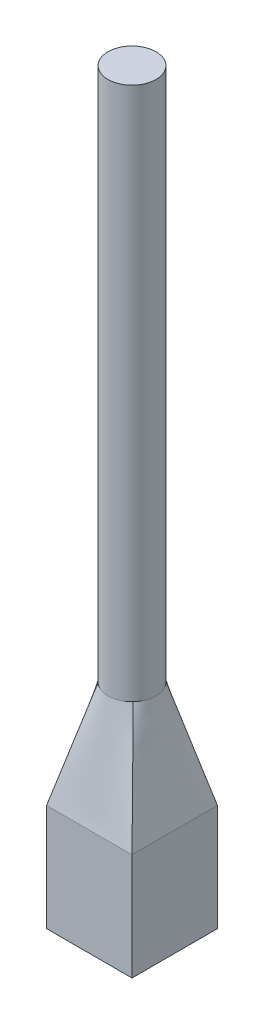
ISO-10303-21;
HEADER;
FILE_DESCRIPTION(('STEP AP214'),'2;1');
FILE_NAME('part.step','',(''),(''),'','','');
FILE_SCHEMA(('AUTOMOTIVE_DESIGN { 1 0 10303 214 1 1 1 1 }'));
ENDSEC;
DATA;
#1=APPLICATION_CONTEXT('core data for automotive mechanical design processes');
#2=APPLICATION_PROTOCOL_DEFINITION('international standard','automotive_design',2000,#1);
#3=PRODUCT_CONTEXT('',#1,'mechanical');
#4=PRODUCT('Part','Part','',(#3));
#5=PRODUCT_RELATED_PRODUCT_CATEGORY('part','',(#4));
#6=PRODUCT_DEFINITION_FORMATION('','',#4);
#7=PRODUCT_DEFINITION_CONTEXT('part definition',#1,'design');
#8=PRODUCT_DEFINITION('design','',#6,#7);
#9=PRODUCT_DEFINITION_SHAPE('','',#8);
#10=(LENGTH_UNIT() NAMED_UNIT(*) SI_UNIT(.MILLI.,.METRE.));
#11=(NAMED_UNIT(*) PLANE_ANGLE_UNIT() SI_UNIT($,.RADIAN.));
#12=(NAMED_UNIT(*) SI_UNIT($,.STERADIAN.) SOLID_ANGLE_UNIT());
#13=UNCERTAINTY_MEASURE_WITH_UNIT(LENGTH_MEASURE(1.E-05),#10,'distance_accuracy_value','');
#14=(GEOMETRIC_REPRESENTATION_CONTEXT(3) GLOBAL_UNCERTAINTY_ASSIGNED_CONTEXT((#13)) GLOBAL_UNIT_ASSIGNED_CONTEXT((#10,
#11,#12)) REPRESENTATION_CONTEXT('',''));
#15=CARTESIAN_POINT('',(0.,0.,0.));
#16=DIRECTION('',(0.,0.,1.));
#17=DIRECTION('',(1.,0.,0.));
#18=AXIS2_PLACEMENT_3D('',#15,#16,#17);
#19=CARTESIAN_POINT('',(-0.4,1.,0.4));
#20=DIRECTION('',(1.,0.,0.));
#21=DIRECTION('',(0.,0.,-1.));
#22=AXIS2_PLACEMENT_3D('',#19,#20,#21);
#23=PLANE('',#22);
#24=DIRECTION('',(0.,0.,1.));
#25=VECTOR('',#24,1.);
#26=CARTESIAN_POINT('',(-0.4,0.,0.4));
#27=LINE('',#26,#25);
#28=CARTESIAN_POINT('',(-0.4,0.,-0.4));
#29=VERTEX_POINT('',#28);
#30=CARTESIAN_POINT('',(-0.4,0.,0.4));
#31=VERTEX_POINT('',#30);
#32=EDGE_CURVE('E181',#29,#31,#27,.T.);
#33=ORIENTED_EDGE('',*,*,#32,.T.);
#34=DIRECTION('',(0.,-1.,0.));
#35=VECTOR('',#34,1.);
#36=CARTESIAN_POINT('',(-0.4,1.,0.4));
#37=LINE('',#36,#35);
#38=CARTESIAN_POINT('',(-0.4,1.,0.4));
#39=VERTEX_POINT('',#38);
#40=EDGE_CURVE('E14',#39,#31,#37,.T.);
#41=ORIENTED_EDGE('',*,*,#40,.F.);
#42=DIRECTION('',(0.,0.,-1.));
#43=VECTOR('',#42,1.);
#44=CARTESIAN_POINT('',(-0.4,1.,0.4));
#45=LINE('',#44,#43);
#46=CARTESIAN_POINT('',(-0.4,1.,-0.4));
#47=VERTEX_POINT('',#46);
#48=EDGE_CURVE('E312',#47,#39,#45,.F.);
#49=ORIENTED_EDGE('',*,*,#48,.F.);
#50=DIRECTION('',(0.,-1.,0.));
#51=VECTOR('',#50,1.);
#52=CARTESIAN_POINT('',(-0.4,1.,-0.4));
#53=LINE('',#52,#51);
#54=EDGE_CURVE('E316',#47,#29,#53,.T.);
#55=ORIENTED_EDGE('',*,*,#54,.T.);
#56=EDGE_LOOP('',(#33,#41,#49,#55));
#57=FACE_BOUND('',#56,.T.);
#58=ADVANCED_FACE('F80',(#57),#23,.F.);
#59=CARTESIAN_POINT('',(0.4,1.,0.4));
#60=DIRECTION('',(0.,0.,-1.));
#61=DIRECTION('',(-1.,0.,0.));
#62=AXIS2_PLACEMENT_3D('',#59,#60,#61);
#63=PLANE('',#62);
#64=DIRECTION('',(1.,0.,0.));
#65=VECTOR('',#64,1.);
#66=CARTESIAN_POINT('',(0.4,0.,0.4));
#67=LINE('',#66,#65);
#68=CARTESIAN_POINT('',(0.4,0.,0.4));
#69=VERTEX_POINT('',#68);
#70=EDGE_CURVE('E302',#31,#69,#67,.T.);
#71=ORIENTED_EDGE('',*,*,#70,.T.);
#72=DIRECTION('',(0.,-1.,0.));
#73=VECTOR('',#72,1.);
#74=CARTESIAN_POINT('',(0.4,1.,0.4));
#75=LINE('',#74,#73);
#76=CARTESIAN_POINT('',(0.4,1.,0.4));
#77=VERTEX_POINT('',#76);
#78=EDGE_CURVE('E88',#77,#69,#75,.T.);
#79=ORIENTED_EDGE('',*,*,#78,.F.);
#80=DIRECTION('',(-1.,0.,0.));
#81=VECTOR('',#80,1.);
#82=CARTESIAN_POINT('',(0.4,1.,0.4));
#83=LINE('',#82,#81);
#84=EDGE_CURVE('E117',#39,#77,#83,.F.);
#85=ORIENTED_EDGE('',*,*,#84,.F.);
#86=ORIENTED_EDGE('',*,*,#40,.T.);
#87=EDGE_LOOP('',(#71,#79,#85,#86));
#88=FACE_BOUND('',#87,.T.);
#89=ADVANCED_FACE('F296',(#88),#63,.F.);
#90=CARTESIAN_POINT('',(0.4,1.,0.4));
#91=DIRECTION('',(-1.,0.,0.));
#92=DIRECTION('',(0.,0.,1.));
#93=AXIS2_PLACEMENT_3D('',#90,#91,#92);
#94=PLANE('',#93);
#95=DIRECTION('',(0.,0.,-1.));
#96=VECTOR('',#95,1.);
#97=CARTESIAN_POINT('',(0.4,0.,0.4));
#98=LINE('',#97,#96);
#99=CARTESIAN_POINT('',(0.4,0.,-0.4));
#100=VERTEX_POINT('',#99);
#101=EDGE_CURVE('E308',#69,#100,#98,.T.);
#102=ORIENTED_EDGE('',*,*,#101,.T.);
#103=DIRECTION('',(0.,-1.,0.));
#104=VECTOR('',#103,1.);
#105=CARTESIAN_POINT('',(0.4,1.,-0.4));
#106=LINE('',#105,#104);
#107=CARTESIAN_POINT('',(0.4,1.,-0.4));
#108=VERTEX_POINT('',#107);
#109=EDGE_CURVE('E105',#108,#100,#106,.T.);
#110=ORIENTED_EDGE('',*,*,#109,.F.);
#111=DIRECTION('',(0.,0.,1.));
#112=VECTOR('',#111,1.);
#113=CARTESIAN_POINT('',(0.4,1.,0.4));
#114=LINE('',#113,#112);
#115=EDGE_CURVE('E255',#77,#108,#114,.F.);
#116=ORIENTED_EDGE('',*,*,#115,.F.);
#117=ORIENTED_EDGE('',*,*,#78,.T.);
#118=EDGE_LOOP('',(#102,#110,#116,#117));
#119=FACE_BOUND('',#118,.T.);
#120=ADVANCED_FACE('F294',(#119),#94,.F.);
#121=CARTESIAN_POINT('',(0.4,1.,-0.4));
#122=DIRECTION('',(0.,0.,1.));
#123=DIRECTION('',(1.,0.,0.));
#124=AXIS2_PLACEMENT_3D('',#121,#122,#123);
#125=PLANE('',#124);
#126=DIRECTION('',(-1.,0.,0.));
#127=VECTOR('',#126,1.);
#128=CARTESIAN_POINT('',(0.4,0.,-0.4));
#129=LINE('',#128,#127);
#130=EDGE_CURVE('E124',#100,#29,#129,.T.);
#131=ORIENTED_EDGE('',*,*,#130,.T.);
#132=ORIENTED_EDGE('',*,*,#54,.F.);
#133=DIRECTION('',(1.,0.,0.));
#134=VECTOR('',#133,1.);
#135=CARTESIAN_POINT('',(0.4,1.,-0.4));
#136=LINE('',#135,#134);
#137=EDGE_CURVE('E192',#108,#47,#136,.F.);
#138=ORIENTED_EDGE('',*,*,#137,.F.);
#139=ORIENTED_EDGE('',*,*,#109,.T.);
#140=EDGE_LOOP('',(#131,#132,#138,#139));
#141=FACE_BOUND('',#140,.T.);
#142=ADVANCED_FACE('F290',(#141),#125,.F.);
#143=CARTESIAN_POINT('',(0.,0.,0.));
#144=DIRECTION('',(0.,1.,0.));
#145=DIRECTION('',(0.,0.,1.));
#146=AXIS2_PLACEMENT_3D('',#143,#144,#145);
#147=PLANE('',#146);
#148=DIRECTION('',(1.,0.,0.));
#149=VECTOR('',#148,1.);
#150=CARTESIAN_POINT('',(0.325,0.,-0.325));
#151=LINE('',#150,#149);
#152=CARTESIAN_POINT('',(-0.325,0.,-0.325));
#153=VERTEX_POINT('',#152);
#154=CARTESIAN_POINT('',(0.325,0.,-0.325));
#155=VERTEX_POINT('',#154);
#156=EDGE_CURVE('E222',#153,#155,#151,.T.);
#157=ORIENTED_EDGE('',*,*,#156,.F.);
#158=DIRECTION('',(0.,0.,-1.));
#159=VECTOR('',#158,1.);
#160=CARTESIAN_POINT('',(-0.325,0.,-0.325));
#161=LINE('',#160,#159);
#162=CARTESIAN_POINT('',(-0.325,0.,0.325));
#163=VERTEX_POINT('',#162);
#164=EDGE_CURVE('E96',#163,#153,#161,.T.);
#165=ORIENTED_EDGE('',*,*,#164,.F.);
#166=DIRECTION('',(-1.,0.,0.));
#167=VECTOR('',#166,1.);
#168=CARTESIAN_POINT('',(0.325,0.,0.325));
#169=LINE('',#168,#167);
#170=CARTESIAN_POINT('',(0.325,0.,0.325));
#171=VERTEX_POINT('',#170);
#172=EDGE_CURVE('E211',#171,#163,#169,.T.);
#173=ORIENTED_EDGE('',*,*,#172,.F.);
#174=DIRECTION('',(0.,0.,1.));
#175=VECTOR('',#174,1.);
#176=CARTESIAN_POINT('',(0.325,0.,-0.325));
#177=LINE('',#176,#175);
#178=EDGE_CURVE('E226',#155,#171,#177,.T.);
#179=ORIENTED_EDGE('',*,*,#178,.F.);
#180=EDGE_LOOP('',(#157,#165,#173,#179));
#181=FACE_BOUND('',#180,.T.);
#182=ORIENTED_EDGE('',*,*,#32,.F.);
#183=ORIENTED_EDGE('',*,*,#130,.F.);
#184=ORIENTED_EDGE('',*,*,#101,.F.);
#185=ORIENTED_EDGE('',*,*,#70,.F.);
#186=EDGE_LOOP('',(#182,#183,#184,#185));
#187=FACE_BOUND('',#186,.T.);
#188=ADVANCED_FACE('F282',(#181,#187),#147,.F.);
#189=CARTESIAN_POINT('',(-0.4,1.,-0.4));
#190=CARTESIAN_POINT('',(-0.164830389599453,2.,-0.153153330569376));
#191=CARTESIAN_POINT('',(-0.4,1.,-0.266666666666666));
#192=CARTESIAN_POINT('',(-0.200928975801756,2.,-0.114302435158912));
#193=CARTESIAN_POINT('',(-0.4,1.,-0.133333333333333));
#194=CARTESIAN_POINT('',(-0.227128532442034,2.,-0.0538332559292004));
#195=CARTESIAN_POINT('',(-0.4,1.,0.133333333333334));
#196=CARTESIAN_POINT('',(-0.222568357234575,2.,0.0703471111781654));
#197=CARTESIAN_POINT('',(-0.4,1.,0.266666666666667));
#198=CARTESIAN_POINT('',(-0.192004225979841,2.,0.128731803397149));
#199=CARTESIAN_POINT('',(-0.4,1.,0.4));
#200=CARTESIAN_POINT('',(-0.153153330569376,2.,0.164830389599453));
#201=B_SPLINE_SURFACE_WITH_KNOTS('',3,1,((#189,#190),(#191,#192),(#193,#194),(#195,#196),(#197,
#198),(#199,#200)),.UNSPECIFIED.,.F.,.F.,.F.,(4,2,4),(2,2),(0.,0.5,1.),(0.,1.),.UNSPECIFIED.);
#202=DIRECTION('',(0.23364089742142,0.946502126037737,-0.222588536223584));
#203=VECTOR('',#202,1.);
#204=CARTESIAN_POINT('',(-0.276576665284688,1.5,0.282415194799726));
#205=LINE('',#204,#203);
#206=CARTESIAN_POINT('',(-0.153153330569376,2.,0.164830389599453));
#207=VERTEX_POINT('',#206);
#208=EDGE_CURVE('E176',#39,#207,#205,.T.);
#209=CARTESIAN_POINT('',(0.,2.,0.));
#210=DIRECTION('',(0.,1.,0.));
#211=DIRECTION('',(0.,0.,1.));
#212=AXIS2_PLACEMENT_3D('',#209,#210,#211);
#213=CIRCLE('',#212,0.225);
#214=CARTESIAN_POINT('',(-0.16483148330229,2.,-0.153149269438112));
#215=VERTEX_POINT('',#214);
#216=EDGE_CURVE('E168',#215,#207,#213,.T.);
#217=DIRECTION('',(-0.222588536223584,-0.946502126037737,-0.233640897421419));
#218=VECTOR('',#217,1.);
#219=CARTESIAN_POINT('',(-0.282415194799726,1.5,-0.276576665284688));
#220=LINE('',#219,#218);
#221=EDGE_CURVE('E173',#215,#47,#220,.T.);
#222=ORIENTED_EDGE('',*,*,#48,.T.);
#223=ORIENTED_EDGE('',*,*,#208,.T.);
#224=ORIENTED_EDGE('',*,*,#216,.F.);
#225=ORIENTED_EDGE('',*,*,#221,.T.);
#226=EDGE_LOOP('',(#222,#223,#224,#225));
#227=FACE_BOUND('',#226,.T.);
#228=ADVANCED_FACE('F172',(#227),#201,.T.);
#229=CARTESIAN_POINT('',(-0.4,1.,0.4));
#230=CARTESIAN_POINT('',(-0.153153330569376,2.,0.164830389599453));
#231=CARTESIAN_POINT('',(-0.266666666666666,1.,0.4));
#232=CARTESIAN_POINT('',(-0.114302435158912,2.,0.200928975801756));
#233=CARTESIAN_POINT('',(-0.133333333333333,1.,0.4));
#234=CARTESIAN_POINT('',(-0.0538332559292004,2.,0.227128532442034));
#235=CARTESIAN_POINT('',(0.133333333333333,1.,0.4));
#236=CARTESIAN_POINT('',(0.0703471111781655,2.,0.222568357234575));
#237=CARTESIAN_POINT('',(0.266666666666667,1.,0.4));
#238=CARTESIAN_POINT('',(0.128731803397149,2.,0.192004225979841));
#239=CARTESIAN_POINT('',(0.4,1.,0.4));
#240=CARTESIAN_POINT('',(0.164830389599453,2.,0.153153330569376));
#241=B_SPLINE_SURFACE_WITH_KNOTS('',3,1,((#229,#230),(#231,#232),(#233,#234),(#235,#236),(#237,
#238),(#239,#240)),.UNSPECIFIED.,.F.,.F.,.F.,(4,2,4),(2,2),(0.,0.5,1.),(0.,1.),.UNSPECIFIED.);
#242=DIRECTION('',(-0.222588536223584,0.946502126037737,-0.23364089742142));
#243=VECTOR('',#242,1.);
#244=CARTESIAN_POINT('',(0.282415194799726,1.5,0.276576665284688));
#245=LINE('',#244,#243);
#246=CARTESIAN_POINT('',(0.164830389599453,2.,0.153153330569376));
#247=VERTEX_POINT('',#246);
#248=EDGE_CURVE('E238',#77,#247,#245,.T.);
#249=CARTESIAN_POINT('',(0.,2.,0.));
#250=DIRECTION('',(0.,1.,0.));
#251=DIRECTION('',(0.,0.,1.));
#252=AXIS2_PLACEMENT_3D('',#249,#250,#251);
#253=CIRCLE('',#252,0.225);
#254=EDGE_CURVE('E182',#207,#247,#253,.T.);
#255=ORIENTED_EDGE('',*,*,#84,.T.);
#256=ORIENTED_EDGE('',*,*,#248,.T.);
#257=ORIENTED_EDGE('',*,*,#254,.F.);
#258=ORIENTED_EDGE('',*,*,#208,.F.);
#259=EDGE_LOOP('',(#255,#256,#257,#258));
#260=FACE_BOUND('',#259,.T.);
#261=ADVANCED_FACE('F250',(#260),#241,.T.);
#262=CARTESIAN_POINT('',(0.4,1.,-0.4));
#263=CARTESIAN_POINT('',(0.153153330569376,2.,-0.164830389599453));
#264=CARTESIAN_POINT('',(0.266666666666667,1.,-0.4));
#265=CARTESIAN_POINT('',(0.114302435158912,2.,-0.200928975801756));
#266=CARTESIAN_POINT('',(0.133333333333334,1.,-0.4));
#267=CARTESIAN_POINT('',(0.0538332559292004,2.,-0.227128532442034));
#268=CARTESIAN_POINT('',(-0.133333333333333,1.,-0.4));
#269=CARTESIAN_POINT('',(-0.0703471111781655,2.,-0.222568357234575));
#270=CARTESIAN_POINT('',(-0.266666666666666,1.,-0.4));
#271=CARTESIAN_POINT('',(-0.128731803397149,2.,-0.192004225979841));
#272=CARTESIAN_POINT('',(-0.4,1.,-0.4));
#273=CARTESIAN_POINT('',(-0.164830389599453,2.,-0.153153330569376));
#274=B_SPLINE_SURFACE_WITH_KNOTS('',3,1,((#262,#263),(#264,#265),(#266,#267),(#268,#269),(#270,
#271),(#272,#273)),.UNSPECIFIED.,.F.,.F.,.F.,(4,2,4),(2,2),(0.,0.5,1.),(0.,1.),.UNSPECIFIED.);
#275=CARTESIAN_POINT('',(0.,2.,0.));
#276=DIRECTION('',(0.,1.,0.));
#277=DIRECTION('',(0.,0.,1.));
#278=AXIS2_PLACEMENT_3D('',#275,#276,#277);
#279=CIRCLE('',#278,0.225);
#280=CARTESIAN_POINT('',(0.153153330569376,2.,-0.164830389599453));
#281=VERTEX_POINT('',#280);
#282=EDGE_CURVE('E189',#281,#215,#279,.T.);
#283=DIRECTION('',(-0.23364089742142,0.946502126037737,0.222588536223584));
#284=VECTOR('',#283,1.);
#285=CARTESIAN_POINT('',(0.276576665284688,1.5,-0.282415194799726));
#286=LINE('',#285,#284);
#287=EDGE_CURVE('E200',#108,#281,#286,.T.);
#288=ORIENTED_EDGE('',*,*,#137,.T.);
#289=ORIENTED_EDGE('',*,*,#221,.F.);
#290=ORIENTED_EDGE('',*,*,#282,.F.);
#291=ORIENTED_EDGE('',*,*,#287,.F.);
#292=EDGE_LOOP('',(#288,#289,#290,#291));
#293=FACE_BOUND('',#292,.T.);
#294=ADVANCED_FACE('F187',(#293),#274,.T.);
#295=CARTESIAN_POINT('',(0.4,1.,0.4));
#296=CARTESIAN_POINT('',(0.164830389599453,2.,0.153153330569376));
#297=CARTESIAN_POINT('',(0.4,1.,0.266666666666666));
#298=CARTESIAN_POINT('',(0.200928975801756,2.,0.114302435158912));
#299=CARTESIAN_POINT('',(0.4,1.,0.133333333333333));
#300=CARTESIAN_POINT('',(0.227128532442034,2.,0.0538332559292004));
#301=CARTESIAN_POINT('',(0.4,1.,-0.133333333333334));
#302=CARTESIAN_POINT('',(0.222568357234575,2.,-0.0703471111781655));
#303=CARTESIAN_POINT('',(0.4,1.,-0.266666666666667));
#304=CARTESIAN_POINT('',(0.192004225979841,2.,-0.128731803397149));
#305=CARTESIAN_POINT('',(0.4,1.,-0.4));
#306=CARTESIAN_POINT('',(0.153153330569376,2.,-0.164830389599453));
#307=B_SPLINE_SURFACE_WITH_KNOTS('',3,1,((#295,#296),(#297,#298),(#299,#300),(#301,#302),(#303,
#304),(#305,#306)),.UNSPECIFIED.,.F.,.F.,.F.,(4,2,4),(2,2),(0.,0.5,1.),(0.,1.),.UNSPECIFIED.);
#308=CARTESIAN_POINT('',(0.,2.,0.));
#309=DIRECTION('',(0.,1.,0.));
#310=DIRECTION('',(0.,0.,1.));
#311=AXIS2_PLACEMENT_3D('',#308,#309,#310);
#312=CIRCLE('',#311,0.225);
#313=EDGE_CURVE('E198',#247,#281,#312,.T.);
#314=ORIENTED_EDGE('',*,*,#115,.T.);
#315=ORIENTED_EDGE('',*,*,#287,.T.);
#316=ORIENTED_EDGE('',*,*,#313,.F.);
#317=ORIENTED_EDGE('',*,*,#248,.F.);
#318=EDGE_LOOP('',(#314,#315,#316,#317));
#319=FACE_BOUND('',#318,.T.);
#320=ADVANCED_FACE('F254',(#319),#307,.T.);
#321=CARTESIAN_POINT('',(-0.325,0.1,-0.325));
#322=DIRECTION('',(-1.,0.,0.));
#323=DIRECTION('',(0.,0.,1.));
#324=AXIS2_PLACEMENT_3D('',#321,#322,#323);
#325=PLANE('',#324);
#326=ORIENTED_EDGE('',*,*,#164,.T.);
#327=DIRECTION('',(0.,-1.,0.));
#328=VECTOR('',#327,1.);
#329=CARTESIAN_POINT('',(-0.325,0.1,-0.325));
#330=LINE('',#329,#328);
#331=CARTESIAN_POINT('',(-0.325,0.1,-0.325));
#332=VERTEX_POINT('',#331);
#333=EDGE_CURVE('E220',#332,#153,#330,.T.);
#334=ORIENTED_EDGE('',*,*,#333,.F.);
#335=DIRECTION('',(0.,0.,-1.));
#336=VECTOR('',#335,1.);
#337=CARTESIAN_POINT('',(-0.325,0.1,-0.325));
#338=LINE('',#337,#336);
#339=CARTESIAN_POINT('',(-0.325,0.1,0.325));
#340=VERTEX_POINT('',#339);
#341=EDGE_CURVE('E207',#340,#332,#338,.T.);
#342=ORIENTED_EDGE('',*,*,#341,.F.);
#343=DIRECTION('',(0.,-1.,0.));
#344=VECTOR('',#343,1.);
#345=CARTESIAN_POINT('',(-0.325,0.1,0.325));
#346=LINE('',#345,#344);
#347=EDGE_CURVE('E193',#340,#163,#346,.T.);
#348=ORIENTED_EDGE('',*,*,#347,.T.);
#349=EDGE_LOOP('',(#326,#334,#342,#348));
#350=FACE_BOUND('',#349,.T.);
#351=ADVANCED_FACE('F278',(#350),#325,.F.);
#352=CARTESIAN_POINT('',(0.325,0.1,0.325));
#353=DIRECTION('',(0.,0.,1.));
#354=DIRECTION('',(1.,0.,0.));
#355=AXIS2_PLACEMENT_3D('',#352,#353,#354);
#356=PLANE('',#355);
#357=ORIENTED_EDGE('',*,*,#172,.T.);
#358=ORIENTED_EDGE('',*,*,#347,.F.);
#359=DIRECTION('',(-1.,0.,0.));
#360=VECTOR('',#359,1.);
#361=CARTESIAN_POINT('',(0.325,0.1,0.325));
#362=LINE('',#361,#360);
#363=CARTESIAN_POINT('',(0.325,0.1,0.325));
#364=VERTEX_POINT('',#363);
#365=EDGE_CURVE('E217',#364,#340,#362,.T.);
#366=ORIENTED_EDGE('',*,*,#365,.F.);
#367=DIRECTION('',(0.,-1.,0.));
#368=VECTOR('',#367,1.);
#369=CARTESIAN_POINT('',(0.325,0.1,0.325));
#370=LINE('',#369,#368);
#371=EDGE_CURVE('E232',#364,#171,#370,.T.);
#372=ORIENTED_EDGE('',*,*,#371,.T.);
#373=EDGE_LOOP('',(#357,#358,#366,#372));
#374=FACE_BOUND('',#373,.T.);
#375=ADVANCED_FACE('F374',(#374),#356,.F.);
#376=CARTESIAN_POINT('',(0.325,0.1,-0.325));
#377=DIRECTION('',(1.,0.,0.));
#378=DIRECTION('',(0.,0.,-1.));
#379=AXIS2_PLACEMENT_3D('',#376,#377,#378);
#380=PLANE('',#379);
#381=ORIENTED_EDGE('',*,*,#178,.T.);
#382=ORIENTED_EDGE('',*,*,#371,.F.);
#383=DIRECTION('',(0.,0.,1.));
#384=VECTOR('',#383,1.);
#385=CARTESIAN_POINT('',(0.325,0.1,-0.325));
#386=LINE('',#385,#384);
#387=CARTESIAN_POINT('',(0.325,0.1,-0.325));
#388=VERTEX_POINT('',#387);
#389=EDGE_CURVE('E214',#388,#364,#386,.T.);
#390=ORIENTED_EDGE('',*,*,#389,.F.);
#391=DIRECTION('',(0.,-1.,0.));
#392=VECTOR('',#391,1.);
#393=CARTESIAN_POINT('',(0.325,0.1,-0.325));
#394=LINE('',#393,#392);
#395=EDGE_CURVE('E234',#388,#155,#394,.T.);
#396=ORIENTED_EDGE('',*,*,#395,.T.);
#397=EDGE_LOOP('',(#381,#382,#390,#396));
#398=FACE_BOUND('',#397,.T.);
#399=ADVANCED_FACE('F384',(#398),#380,.F.);
#400=CARTESIAN_POINT('',(0.325,0.1,-0.325));
#401=DIRECTION('',(0.,0.,-1.));
#402=DIRECTION('',(-1.,0.,0.));
#403=AXIS2_PLACEMENT_3D('',#400,#401,#402);
#404=PLANE('',#403);
#405=ORIENTED_EDGE('',*,*,#156,.T.);
#406=ORIENTED_EDGE('',*,*,#395,.F.);
#407=DIRECTION('',(1.,0.,0.));
#408=VECTOR('',#407,1.);
#409=CARTESIAN_POINT('',(0.325,0.1,-0.325));
#410=LINE('',#409,#408);
#411=EDGE_CURVE('E210',#332,#388,#410,.T.);
#412=ORIENTED_EDGE('',*,*,#411,.F.);
#413=ORIENTED_EDGE('',*,*,#333,.T.);
#414=EDGE_LOOP('',(#405,#406,#412,#413));
#415=FACE_BOUND('',#414,.T.);
#416=ADVANCED_FACE('F394',(#415),#404,.F.);
#417=CARTESIAN_POINT('',(0.,0.1,0.));
#418=DIRECTION('',(0.,-1.,0.));
#419=DIRECTION('',(0.,0.,-1.));
#420=AXIS2_PLACEMENT_3D('',#417,#418,#419);
#421=PLANE('',#420);
#422=ORIENTED_EDGE('',*,*,#341,.T.);
#423=ORIENTED_EDGE('',*,*,#411,.T.);
#424=ORIENTED_EDGE('',*,*,#389,.T.);
#425=ORIENTED_EDGE('',*,*,#365,.T.);
#426=EDGE_LOOP('',(#422,#423,#424,#425));
#427=FACE_BOUND('',#426,.T.);
#428=ADVANCED_FACE('F404',(#427),#421,.T.);
#429=CARTESIAN_POINT('',(0.,7.,0.));
#430=DIRECTION('',(0.,-1.,0.));
#431=DIRECTION('',(0.,0.,-1.));
#432=AXIS2_PLACEMENT_3D('',#429,#430,#431);
#433=CYLINDRICAL_SURFACE('',#432,0.225);
#434=CARTESIAN_POINT('',(0.,7.,0.));
#435=DIRECTION('',(0.,1.,0.));
#436=DIRECTION('',(0.,0.,1.));
#437=AXIS2_PLACEMENT_3D('',#434,#435,#436);
#438=CIRCLE('',#437,0.225);
#439=CARTESIAN_POINT('',(0.,7.,0.225));
#440=VERTEX_POINT('',#439);
#441=EDGE_CURVE('E223',#440,#440,#438,.T.);
#442=ORIENTED_EDGE('',*,*,#441,.F.);
#443=EDGE_LOOP('',(#442));
#444=FACE_BOUND('',#443,.T.);
#445=ORIENTED_EDGE('',*,*,#313,.T.);
#446=ORIENTED_EDGE('',*,*,#282,.T.);
#447=ORIENTED_EDGE('',*,*,#216,.T.);
#448=ORIENTED_EDGE('',*,*,#254,.T.);
#449=EDGE_LOOP('',(#445,#446,#447,#448));
#450=FACE_BOUND('',#449,.T.);
#451=ADVANCED_FACE('F197',(#444,#450),#433,.T.);
#452=CARTESIAN_POINT('',(0.,7.,0.));
#453=DIRECTION('',(0.,1.,0.));
#454=DIRECTION('',(0.,0.,1.));
#455=AXIS2_PLACEMENT_3D('',#452,#453,#454);
#456=PLANE('',#455);
#457=ORIENTED_EDGE('',*,*,#441,.T.);
#458=EDGE_LOOP('',(#457));
#459=FACE_BOUND('',#458,.T.);
#460=ADVANCED_FACE('F449',(#459),#456,.T.);
#461=CLOSED_SHELL('',(#58,#89,#120,#142,#188,#228,#261,#294,#320,#351,#375,#399,#416,#428,#451,#460));
#462=MANIFOLD_SOLID_BREP('B2',#461);
#463=ADVANCED_BREP_SHAPE_REPRESENTATION('',(#18,#462),#14);
#464=SHAPE_DEFINITION_REPRESENTATION(#9,#463);
ENDSEC;
END-ISO-10303-21;
